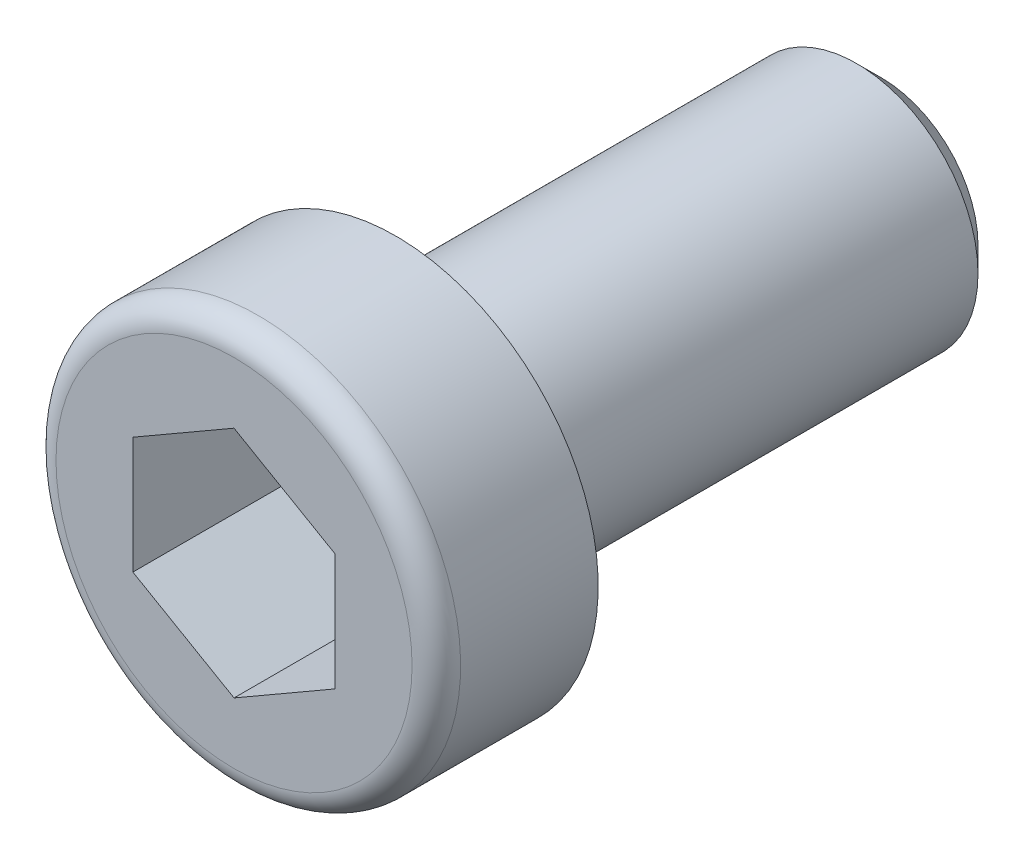
ISO-10303-21;
HEADER;
FILE_DESCRIPTION(('STEP AP214'),'2;1');
FILE_NAME('part.step','',(''),(''),'','','');
FILE_SCHEMA(('AUTOMOTIVE_DESIGN { 1 0 10303 214 1 1 1 1 }'));
ENDSEC;
DATA;
#1=APPLICATION_CONTEXT('core data for automotive mechanical design processes');
#2=APPLICATION_PROTOCOL_DEFINITION('international standard','automotive_design',2000,#1);
#3=PRODUCT_CONTEXT('',#1,'mechanical');
#4=PRODUCT('Part','Part','',(#3));
#5=PRODUCT_RELATED_PRODUCT_CATEGORY('part','',(#4));
#6=PRODUCT_DEFINITION_FORMATION('','',#4);
#7=PRODUCT_DEFINITION_CONTEXT('part definition',#1,'design');
#8=PRODUCT_DEFINITION('design','',#6,#7);
#9=PRODUCT_DEFINITION_SHAPE('','',#8);
#10=(LENGTH_UNIT() NAMED_UNIT(*) SI_UNIT(.MILLI.,.METRE.));
#11=(NAMED_UNIT(*) PLANE_ANGLE_UNIT() SI_UNIT($,.RADIAN.));
#12=(NAMED_UNIT(*) SI_UNIT($,.STERADIAN.) SOLID_ANGLE_UNIT());
#13=UNCERTAINTY_MEASURE_WITH_UNIT(LENGTH_MEASURE(1.E-05),#10,'distance_accuracy_value','');
#14=(GEOMETRIC_REPRESENTATION_CONTEXT(3) GLOBAL_UNCERTAINTY_ASSIGNED_CONTEXT((#13)) GLOBAL_UNIT_ASSIGNED_CONTEXT((#10,
#11,#12)) REPRESENTATION_CONTEXT('',''));
#15=CARTESIAN_POINT('',(0.,0.,0.));
#16=DIRECTION('',(0.,0.,1.));
#17=DIRECTION('',(1.,0.,0.));
#18=AXIS2_PLACEMENT_3D('',#15,#16,#17);
#19=CARTESIAN_POINT('',(0.,-14.95,4.));
#20=DIRECTION('',(0.,0.,1.));
#21=DIRECTION('',(1.,0.,0.));
#22=AXIS2_PLACEMENT_3D('',#19,#20,#21);
#23=PLANE('',#22);
#24=DIRECTION('',(0.,1.,0.));
#25=VECTOR('',#24,1.);
#26=CARTESIAN_POINT('',(-2.5,-14.95,4.));
#27=LINE('',#26,#25);
#28=CARTESIAN_POINT('',(-2.5000000000014,-16.3933756729765,4.));
#29=VERTEX_POINT('',#28);
#30=CARTESIAN_POINT('',(-2.5000000000014,-13.5066243270235,4.));
#31=VERTEX_POINT('',#30);
#32=EDGE_CURVE('E82',#29,#31,#27,.T.);
#33=ORIENTED_EDGE('',*,*,#32,.F.);
#34=DIRECTION('',(-0.866025403788329,0.499999999993262,0.));
#35=VECTOR('',#34,1.);
#36=CARTESIAN_POINT('',(-1.24999999998315,-17.1150635094708,4.));
#37=LINE('',#36,#35);
#38=CARTESIAN_POINT('',(1.96540675119893E-11,-17.8367513459432,4.));
#39=VERTEX_POINT('',#38);
#40=EDGE_CURVE('E84',#39,#29,#37,.T.);
#41=ORIENTED_EDGE('',*,*,#40,.F.);
#42=DIRECTION('',(-0.866025403788329,-0.499999999993262,0.));
#43=VECTOR('',#42,1.);
#44=CARTESIAN_POINT('',(1.24999999998315,-17.1150635094708,4.));
#45=LINE('',#44,#43);
#46=CARTESIAN_POINT('',(2.5000000000014,-16.3933756729765,4.));
#47=VERTEX_POINT('',#46);
#48=EDGE_CURVE('E86',#47,#39,#45,.T.);
#49=ORIENTED_EDGE('',*,*,#48,.F.);
#50=DIRECTION('',(0.,1.,0.));
#51=VECTOR('',#50,1.);
#52=CARTESIAN_POINT('',(2.5,-14.95,4.));
#53=LINE('',#52,#51);
#54=CARTESIAN_POINT('',(2.5000000000014,-13.5066243270235,4.));
#55=VERTEX_POINT('',#54);
#56=EDGE_CURVE('E208',#55,#47,#53,.F.);
#57=ORIENTED_EDGE('',*,*,#56,.F.);
#58=DIRECTION('',(0.866025403788329,-0.499999999993262,0.));
#59=VECTOR('',#58,1.);
#60=CARTESIAN_POINT('',(1.24999999998315,-12.7849364905292,4.));
#61=LINE('',#60,#59);
#62=CARTESIAN_POINT('',(-1.96530582606547E-11,-12.0632486540568,4.));
#63=VERTEX_POINT('',#62);
#64=EDGE_CURVE('E213',#63,#55,#61,.T.);
#65=ORIENTED_EDGE('',*,*,#64,.F.);
#66=DIRECTION('',(0.866025403788329,0.499999999993262,0.));
#67=VECTOR('',#66,1.);
#68=CARTESIAN_POINT('',(-1.24999999998315,-12.7849364905292,4.));
#69=LINE('',#68,#67);
#70=EDGE_CURVE('E219',#31,#63,#69,.T.);
#71=ORIENTED_EDGE('',*,*,#70,.F.);
#72=EDGE_LOOP('',(#33,#41,#49,#57,#65,#71));
#73=FACE_BOUND('',#72,.T.);
#74=ADVANCED_FACE('F18',(#73),#23,.T.);
#75=CARTESIAN_POINT('',(1.24999999998315,-17.1150635094708,5.92438911505884));
#76=DIRECTION('',(-0.499999999993262,0.866025403788329,0.));
#77=DIRECTION('',(-0.866025403788329,-0.499999999993262,0.));
#78=AXIS2_PLACEMENT_3D('',#75,#76,#77);
#79=PLANE('',#78);
#80=DIRECTION('',(-0.866025403782503,-0.500000000003353,0.));
#81=VECTOR('',#80,1.);
#82=CARTESIAN_POINT('',(2.5,-16.3933756729741,8.));
#83=LINE('',#82,#81);
#84=CARTESIAN_POINT('',(2.5000000000028,-16.3933756729789,8.));
#85=VERTEX_POINT('',#84);
#86=CARTESIAN_POINT('',(1.68469550376055E-11,-17.8367513459384,8.));
#87=VERTEX_POINT('',#86);
#88=EDGE_CURVE('E206',#85,#87,#83,.T.);
#89=ORIENTED_EDGE('',*,*,#88,.F.);
#90=DIRECTION('',(0.,0.,1.));
#91=VECTOR('',#90,1.);
#92=CARTESIAN_POINT('',(2.5,-16.3933756729741,5.92438911505884));
#93=LINE('',#92,#91);
#94=EDGE_CURVE('E97',#47,#85,#93,.T.);
#95=ORIENTED_EDGE('',*,*,#94,.F.);
#96=ORIENTED_EDGE('',*,*,#48,.T.);
#97=DIRECTION('',(0.,0.,1.));
#98=VECTOR('',#97,1.);
#99=CARTESIAN_POINT('',(2.24590311626027E-11,-17.8367513459481,5.92438911505884));
#100=LINE('',#99,#98);
#101=EDGE_CURVE('E91',#87,#39,#100,.F.);
#102=ORIENTED_EDGE('',*,*,#101,.F.);
#103=EDGE_LOOP('',(#89,#95,#96,#102));
#104=FACE_BOUND('',#103,.T.);
#105=ADVANCED_FACE('F94',(#104),#79,.T.);
#106=CARTESIAN_POINT('',(-1.24999999998315,-17.1150635094708,5.92438911505884));
#107=DIRECTION('',(0.499999999993262,0.866025403788329,0.));
#108=DIRECTION('',(-0.866025403788329,0.499999999993262,0.));
#109=AXIS2_PLACEMENT_3D('',#106,#107,#108);
#110=PLANE('',#109);
#111=DIRECTION('',(-0.866025403786393,0.499999999996615,0.));
#112=VECTOR('',#111,1.);
#113=CARTESIAN_POINT('',(2.24611440557965E-11,-17.8367513459481,8.));
#114=LINE('',#113,#112);
#115=CARTESIAN_POINT('',(-2.5000000000028,-16.3933756729789,8.));
#116=VERTEX_POINT('',#115);
#117=EDGE_CURVE('E102',#87,#116,#114,.T.);
#118=ORIENTED_EDGE('',*,*,#117,.F.);
#119=ORIENTED_EDGE('',*,*,#101,.T.);
#120=ORIENTED_EDGE('',*,*,#40,.T.);
#121=DIRECTION('',(0.,0.,-1.));
#122=VECTOR('',#121,1.);
#123=CARTESIAN_POINT('',(-2.5,-16.3933756729741,5.92438911505884));
#124=LINE('',#123,#122);
#125=EDGE_CURVE('E105',#116,#29,#124,.T.);
#126=ORIENTED_EDGE('',*,*,#125,.F.);
#127=EDGE_LOOP('',(#118,#119,#120,#126));
#128=FACE_BOUND('',#127,.T.);
#129=ADVANCED_FACE('F100',(#128),#110,.T.);
#130=CARTESIAN_POINT('',(-2.5,-14.95,5.92438911505884));
#131=DIRECTION('',(1.,0.,0.));
#132=DIRECTION('',(0.,0.,-1.));
#133=AXIS2_PLACEMENT_3D('',#130,#131,#132);
#134=PLANE('',#133);
#135=DIRECTION('',(0.,1.,0.));
#136=VECTOR('',#135,1.);
#137=CARTESIAN_POINT('',(-2.5,-14.95,8.));
#138=LINE('',#137,#136);
#139=CARTESIAN_POINT('',(-2.5000000000014,-13.5066243270235,8.));
#140=VERTEX_POINT('',#139);
#141=EDGE_CURVE('E225',#116,#140,#138,.T.);
#142=ORIENTED_EDGE('',*,*,#141,.F.);
#143=ORIENTED_EDGE('',*,*,#125,.T.);
#144=ORIENTED_EDGE('',*,*,#32,.T.);
#145=DIRECTION('',(0.,0.,1.));
#146=VECTOR('',#145,1.);
#147=CARTESIAN_POINT('',(-2.50000000000559,-13.5066243270162,5.92438911505884));
#148=LINE('',#147,#146);
#149=EDGE_CURVE('E216',#140,#31,#148,.F.);
#150=ORIENTED_EDGE('',*,*,#149,.F.);
#151=EDGE_LOOP('',(#142,#143,#144,#150));
#152=FACE_BOUND('',#151,.T.);
#153=ADVANCED_FACE('F223',(#152),#134,.T.);
#154=CARTESIAN_POINT('',(-1.24999999998315,-12.7849364905292,5.92438911505884));
#155=DIRECTION('',(0.499999999993262,-0.866025403788329,0.));
#156=DIRECTION('',(0.866025403788329,0.499999999993262,0.));
#157=AXIS2_PLACEMENT_3D('',#154,#155,#156);
#158=PLANE('',#157);
#159=DIRECTION('',(0.866025403782503,0.500000000003353,0.));
#160=VECTOR('',#159,1.);
#161=CARTESIAN_POINT('',(-2.5,-13.5066243270259,8.));
#162=LINE('',#161,#160);
#163=CARTESIAN_POINT('',(-1.68463587264106E-11,-12.0632486540616,8.));
#164=VERTEX_POINT('',#163);
#165=EDGE_CURVE('E229',#140,#164,#162,.T.);
#166=ORIENTED_EDGE('',*,*,#165,.F.);
#167=ORIENTED_EDGE('',*,*,#149,.T.);
#168=ORIENTED_EDGE('',*,*,#70,.T.);
#169=DIRECTION('',(0.,0.,1.));
#170=VECTOR('',#169,1.);
#171=CARTESIAN_POINT('',(-2.24590311626027E-11,-12.0632486540519,5.92438911505884));
#172=LINE('',#171,#170);
#173=EDGE_CURVE('E210',#164,#63,#172,.F.);
#174=ORIENTED_EDGE('',*,*,#173,.F.);
#175=EDGE_LOOP('',(#166,#167,#168,#174));
#176=FACE_BOUND('',#175,.T.);
#177=ADVANCED_FACE('F356',(#176),#158,.T.);
#178=CARTESIAN_POINT('',(1.24999999998315,-12.7849364905292,5.92438911505884));
#179=DIRECTION('',(-0.499999999993262,-0.866025403788329,0.));
#180=DIRECTION('',(0.866025403788329,-0.499999999993262,0.));
#181=AXIS2_PLACEMENT_3D('',#178,#179,#180);
#182=PLANE('',#181);
#183=DIRECTION('',(0.866025403786393,-0.499999999996614,0.));
#184=VECTOR('',#183,1.);
#185=CARTESIAN_POINT('',(-2.24611440557965E-11,-12.0632486540519,8.));
#186=LINE('',#185,#184);
#187=CARTESIAN_POINT('',(2.5000000000028,-13.5066243270211,8.));
#188=VERTEX_POINT('',#187);
#189=EDGE_CURVE('E236',#164,#188,#186,.T.);
#190=ORIENTED_EDGE('',*,*,#189,.F.);
#191=ORIENTED_EDGE('',*,*,#173,.T.);
#192=ORIENTED_EDGE('',*,*,#64,.T.);
#193=DIRECTION('',(0.,0.,1.));
#194=VECTOR('',#193,1.);
#195=CARTESIAN_POINT('',(2.5,-13.5066243270259,5.92438911505884));
#196=LINE('',#195,#194);
#197=EDGE_CURVE('E198',#188,#55,#196,.F.);
#198=ORIENTED_EDGE('',*,*,#197,.F.);
#199=EDGE_LOOP('',(#190,#191,#192,#198));
#200=FACE_BOUND('',#199,.T.);
#201=ADVANCED_FACE('F347',(#200),#182,.T.);
#202=CARTESIAN_POINT('',(2.5,-14.95,5.92438911505884));
#203=DIRECTION('',(-1.,0.,0.));
#204=DIRECTION('',(0.,0.,1.));
#205=AXIS2_PLACEMENT_3D('',#202,#203,#204);
#206=PLANE('',#205);
#207=DIRECTION('',(0.,1.,0.));
#208=VECTOR('',#207,1.);
#209=CARTESIAN_POINT('',(2.5,-14.95,8.));
#210=LINE('',#209,#208);
#211=EDGE_CURVE('E238',#188,#85,#210,.F.);
#212=ORIENTED_EDGE('',*,*,#211,.F.);
#213=ORIENTED_EDGE('',*,*,#197,.T.);
#214=ORIENTED_EDGE('',*,*,#56,.T.);
#215=ORIENTED_EDGE('',*,*,#94,.T.);
#216=EDGE_LOOP('',(#212,#213,#214,#215));
#217=FACE_BOUND('',#216,.T.);
#218=ADVANCED_FACE('F339',(#217),#206,.T.);
#219=CARTESIAN_POINT('',(0.,-14.95,8.));
#220=DIRECTION('',(0.,0.,1.));
#221=DIRECTION('',(1.,0.,0.));
#222=AXIS2_PLACEMENT_3D('',#219,#220,#221);
#223=PLANE('',#222);
#224=CARTESIAN_POINT('',(0.,-14.95,8.));
#225=DIRECTION('',(0.,0.,-1.));
#226=DIRECTION('',(0.,1.,0.));
#227=AXIS2_PLACEMENT_3D('',#224,#225,#226);
#228=CIRCLE('',#227,4.4);
#229=CARTESIAN_POINT('',(0.,-10.55,8.));
#230=VERTEX_POINT('',#229);
#231=CARTESIAN_POINT('',(0.,-19.35,8.));
#232=VERTEX_POINT('',#231);
#233=EDGE_CURVE('E259',#230,#232,#228,.T.);
#234=ORIENTED_EDGE('',*,*,#233,.F.);
#235=CARTESIAN_POINT('',(0.,-14.95,8.));
#236=DIRECTION('',(0.,0.,-1.));
#237=DIRECTION('',(0.,-1.,0.));
#238=AXIS2_PLACEMENT_3D('',#235,#236,#237);
#239=CIRCLE('',#238,4.4);
#240=EDGE_CURVE('E240',#232,#230,#239,.T.);
#241=ORIENTED_EDGE('',*,*,#240,.F.);
#242=EDGE_LOOP('',(#234,#241));
#243=FACE_BOUND('',#242,.T.);
#244=ORIENTED_EDGE('',*,*,#189,.T.);
#245=ORIENTED_EDGE('',*,*,#211,.T.);
#246=ORIENTED_EDGE('',*,*,#88,.T.);
#247=ORIENTED_EDGE('',*,*,#117,.T.);
#248=ORIENTED_EDGE('',*,*,#141,.T.);
#249=ORIENTED_EDGE('',*,*,#165,.T.);
#250=EDGE_LOOP('',(#244,#245,#246,#247,#248,#249));
#251=FACE_BOUND('',#250,.T.);
#252=ADVANCED_FACE('F186',(#243,#251),#223,.T.);
#253=CARTESIAN_POINT('',(0.,-14.95,7.4));
#254=DIRECTION('',(0.,0.,-1.));
#255=DIRECTION('',(0.,-1.,0.));
#256=AXIS2_PLACEMENT_3D('',#253,#254,#255);
#257=TOROIDAL_SURFACE('',#256,4.4,0.6);
#258=CARTESIAN_POINT('',(0.,-14.95,7.4));
#259=DIRECTION('',(0.,0.,-1.));
#260=DIRECTION('',(-1.,0.,0.));
#261=AXIS2_PLACEMENT_3D('',#258,#259,#260);
#262=CIRCLE('',#261,5.);
#263=CARTESIAN_POINT('',(-5.,-14.95,7.4));
#264=VERTEX_POINT('',#263);
#265=EDGE_CURVE('E116',#264,#264,#262,.T.);
#266=ORIENTED_EDGE('',*,*,#265,.F.);
#267=EDGE_LOOP('',(#266));
#268=FACE_BOUND('',#267,.T.);
#269=ORIENTED_EDGE('',*,*,#233,.T.);
#270=ORIENTED_EDGE('',*,*,#240,.T.);
#271=EDGE_LOOP('',(#269,#270));
#272=FACE_BOUND('',#271,.T.);
#273=ADVANCED_FACE('F182',(#268,#272),#257,.T.);
#274=CARTESIAN_POINT('',(0.,-14.95,5.7));
#275=DIRECTION('',(0.,0.,-1.));
#276=DIRECTION('',(-1.,0.,0.));
#277=AXIS2_PLACEMENT_3D('',#274,#275,#276);
#278=CYLINDRICAL_SURFACE('',#277,5.);
#279=CARTESIAN_POINT('',(0.,-14.95,4.));
#280=DIRECTION('',(0.,0.,-1.));
#281=DIRECTION('',(-1.,0.,0.));
#282=AXIS2_PLACEMENT_3D('',#279,#280,#281);
#283=CIRCLE('',#282,5.);
#284=CARTESIAN_POINT('',(-5.,-14.95,4.));
#285=VERTEX_POINT('',#284);
#286=EDGE_CURVE('E112',#285,#285,#283,.T.);
#287=ORIENTED_EDGE('',*,*,#286,.F.);
#288=EDGE_LOOP('',(#287));
#289=FACE_BOUND('',#288,.T.);
#290=ORIENTED_EDGE('',*,*,#265,.T.);
#291=EDGE_LOOP('',(#290));
#292=FACE_BOUND('',#291,.T.);
#293=ADVANCED_FACE('F156',(#289,#292),#278,.T.);
#294=CARTESIAN_POINT('',(0.,-14.95,4.));
#295=DIRECTION('',(0.,0.,-1.));
#296=DIRECTION('',(-1.,0.,0.));
#297=AXIS2_PLACEMENT_3D('',#294,#295,#296);
#298=PLANE('',#297);
#299=ORIENTED_EDGE('',*,*,#286,.T.);
#300=EDGE_LOOP('',(#299));
#301=FACE_BOUND('',#300,.T.);
#302=CARTESIAN_POINT('',(0.,-14.95,4.));
#303=DIRECTION('',(0.,0.,-1.));
#304=DIRECTION('',(0.,1.,0.));
#305=AXIS2_PLACEMENT_3D('',#302,#303,#304);
#306=CIRCLE('',#305,3.25);
#307=CARTESIAN_POINT('',(0.,-18.2,4.));
#308=VERTEX_POINT('',#307);
#309=CARTESIAN_POINT('',(0.,-11.7,4.));
#310=VERTEX_POINT('',#309);
#311=EDGE_CURVE('E115',#308,#310,#306,.F.);
#312=ORIENTED_EDGE('',*,*,#311,.T.);
#313=CARTESIAN_POINT('',(0.,-14.95,4.));
#314=DIRECTION('',(0.,0.,-1.));
#315=DIRECTION('',(0.,-1.,0.));
#316=AXIS2_PLACEMENT_3D('',#313,#314,#315);
#317=CIRCLE('',#316,3.25);
#318=EDGE_CURVE('E37',#310,#308,#317,.F.);
#319=ORIENTED_EDGE('',*,*,#318,.T.);
#320=EDGE_LOOP('',(#312,#319));
#321=FACE_BOUND('',#320,.T.);
#322=ADVANCED_FACE('F147',(#301,#321),#298,.T.);
#323=CARTESIAN_POINT('',(0.,-14.95,-8.));
#324=DIRECTION('',(0.,0.,1.));
#325=DIRECTION('',(1.,0.,0.));
#326=AXIS2_PLACEMENT_3D('',#323,#324,#325);
#327=PLANE('',#326);
#328=CARTESIAN_POINT('',(0.,-14.95,-7.99999999998026));
#329=DIRECTION('',(0.,0.,1.));
#330=DIRECTION('',(1.,0.,0.));
#331=AXIS2_PLACEMENT_3D('',#328,#329,#330);
#332=CIRCLE('',#331,2.38655000003973);
#333=CARTESIAN_POINT('',(2.38655000003973,-14.95,-7.99999999998026));
#334=VERTEX_POINT('',#333);
#335=EDGE_CURVE('E109',#334,#334,#332,.T.);
#336=ORIENTED_EDGE('',*,*,#335,.F.);
#337=EDGE_LOOP('',(#336));
#338=FACE_BOUND('',#337,.T.);
#339=ADVANCED_FACE('F134',(#338),#327,.F.);
#340=CARTESIAN_POINT('',(0.,-14.95,3.75));
#341=DIRECTION('',(0.,0.,-1.));
#342=DIRECTION('',(0.,-1.,0.));
#343=AXIS2_PLACEMENT_3D('',#340,#341,#342);
#344=TOROIDAL_SURFACE('',#343,3.25,0.25);
#345=ORIENTED_EDGE('',*,*,#318,.F.);
#346=ORIENTED_EDGE('',*,*,#311,.F.);
#347=EDGE_LOOP('',(#345,#346));
#348=FACE_BOUND('',#347,.T.);
#349=CARTESIAN_POINT('',(0.,-14.95,3.75));
#350=DIRECTION('',(0.,0.,-1.));
#351=DIRECTION('',(-1.,0.,0.));
#352=AXIS2_PLACEMENT_3D('',#349,#350,#351);
#353=CIRCLE('',#352,3.);
#354=CARTESIAN_POINT('',(-3.,-14.95,3.75));
#355=VERTEX_POINT('',#354);
#356=EDGE_CURVE('E29',#355,#355,#353,.T.);
#357=ORIENTED_EDGE('',*,*,#356,.F.);
#358=EDGE_LOOP('',(#357));
#359=FACE_BOUND('',#358,.T.);
#360=ADVANCED_FACE('F122',(#348,#359),#344,.F.);
#361=CARTESIAN_POINT('',(0.,-14.95,-7.38655000003519));
#362=DIRECTION('',(0.,0.,1.));
#363=DIRECTION('',(1.,0.,0.));
#364=AXIS2_PLACEMENT_3D('',#361,#362,#363);
#365=CONICAL_SURFACE('',#364,2.99999999998481,0.785398163397448);
#366=ORIENTED_EDGE('',*,*,#335,.T.);
#367=EDGE_LOOP('',(#366));
#368=FACE_BOUND('',#367,.T.);
#369=CARTESIAN_POINT('',(0.,-14.95,-7.38655));
#370=DIRECTION('',(0.,0.,-1.));
#371=DIRECTION('',(-1.,0.,0.));
#372=AXIS2_PLACEMENT_3D('',#369,#370,#371);
#373=CIRCLE('',#372,3.);
#374=CARTESIAN_POINT('',(-3.,-14.95,-7.38655));
#375=VERTEX_POINT('',#374);
#376=EDGE_CURVE('E11',#375,#375,#373,.F.);
#377=ORIENTED_EDGE('',*,*,#376,.F.);
#378=EDGE_LOOP('',(#377));
#379=FACE_BOUND('',#378,.T.);
#380=ADVANCED_FACE('F133',(#368,#379),#365,.T.);
#381=CARTESIAN_POINT('',(0.,-14.95,-1.693275));
#382=DIRECTION('',(0.,0.,-1.));
#383=DIRECTION('',(-1.,0.,0.));
#384=AXIS2_PLACEMENT_3D('',#381,#382,#383);
#385=CYLINDRICAL_SURFACE('',#384,3.);
#386=ORIENTED_EDGE('',*,*,#356,.T.);
#387=EDGE_LOOP('',(#386));
#388=FACE_BOUND('',#387,.T.);
#389=ORIENTED_EDGE('',*,*,#376,.T.);
#390=EDGE_LOOP('',(#389));
#391=FACE_BOUND('',#390,.T.);
#392=ADVANCED_FACE('F270',(#388,#391),#385,.T.);
#393=CLOSED_SHELL('',(#74,#105,#129,#153,#177,#201,#218,#252,#273,#293,#322,#339,#360,#380,#392));
#394=CARTESIAN_POINT('',(0.,-14.95,4.));
#395=DIRECTION('',(0.,0.,-1.));
#396=DIRECTION('',(0.,-1.,0.));
#397=AXIS2_PLACEMENT_3D('',#394,#395,#396);
#398=TOROIDAL_SURFACE('',#397,3.,0.06);
#399=ADVANCED_FACE('F280',(),#398,.F.);
#400=CLOSED_SHELL('',(#399));
#401=ORIENTED_CLOSED_SHELL('',*,#400,.T.);
#402=BREP_WITH_VOIDS('B1',#393,(#401));
#403=ADVANCED_BREP_SHAPE_REPRESENTATION('',(#18,#402),#14);
#404=SHAPE_DEFINITION_REPRESENTATION(#9,#403);
ENDSEC;
END-ISO-10303-21;
